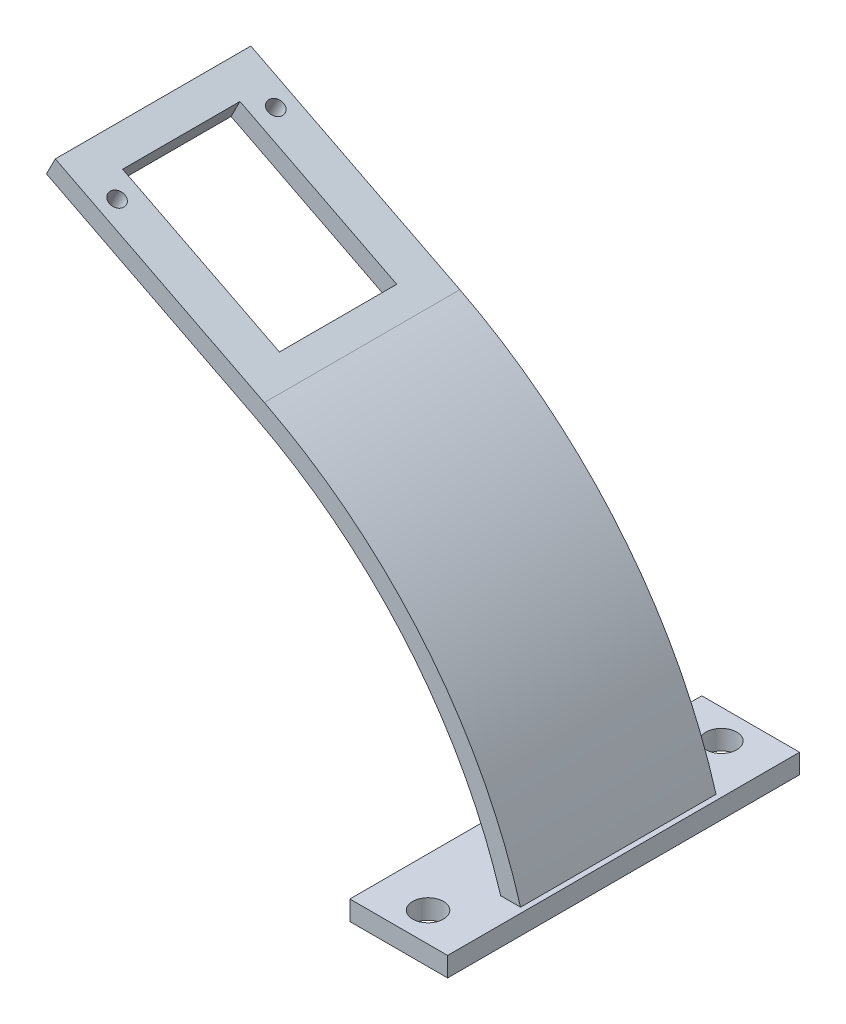
ISO-10303-21;
HEADER;
FILE_DESCRIPTION(('STEP AP214'),'2;1');
FILE_NAME('part.step','',(''),(''),'','','');
FILE_SCHEMA(('AUTOMOTIVE_DESIGN { 1 0 10303 214 1 1 1 1 }'));
ENDSEC;
DATA;
#1=APPLICATION_CONTEXT('core data for automotive mechanical design processes');
#2=APPLICATION_PROTOCOL_DEFINITION('international standard','automotive_design',2000,#1);
#3=PRODUCT_CONTEXT('',#1,'mechanical');
#4=PRODUCT('Part','Part','',(#3));
#5=PRODUCT_RELATED_PRODUCT_CATEGORY('part','',(#4));
#6=PRODUCT_DEFINITION_FORMATION('','',#4);
#7=PRODUCT_DEFINITION_CONTEXT('part definition',#1,'design');
#8=PRODUCT_DEFINITION('design','',#6,#7);
#9=PRODUCT_DEFINITION_SHAPE('','',#8);
#10=(LENGTH_UNIT() NAMED_UNIT(*) SI_UNIT(.MILLI.,.METRE.));
#11=(NAMED_UNIT(*) PLANE_ANGLE_UNIT() SI_UNIT($,.RADIAN.));
#12=(NAMED_UNIT(*) SI_UNIT($,.STERADIAN.) SOLID_ANGLE_UNIT());
#13=UNCERTAINTY_MEASURE_WITH_UNIT(LENGTH_MEASURE(1.E-05),#10,'distance_accuracy_value','');
#14=(GEOMETRIC_REPRESENTATION_CONTEXT(3) GLOBAL_UNCERTAINTY_ASSIGNED_CONTEXT((#13)) GLOBAL_UNIT_ASSIGNED_CONTEXT((#10,
#11,#12)) REPRESENTATION_CONTEXT('',''));
#15=CARTESIAN_POINT('',(0.,0.,0.));
#16=DIRECTION('',(0.,0.,1.));
#17=DIRECTION('',(1.,0.,0.));
#18=AXIS2_PLACEMENT_3D('',#15,#16,#17);
#19=CARTESIAN_POINT('',(-61.4066674593783,-16.1700708573998,25.4));
#20=DIRECTION('',(0.,0.,-1.));
#21=DIRECTION('',(-1.,0.,0.));
#22=AXIS2_PLACEMENT_3D('',#19,#20,#21);
#23=CYLINDRICAL_SURFACE('',#22,63.5);
#24=CARTESIAN_POINT('',(-61.4066674593783,-16.1700708573998,0.));
#25=DIRECTION('',(0.,0.,-1.));
#26=DIRECTION('',(1.,0.,0.));
#27=AXIS2_PLACEMENT_3D('',#24,#25,#26);
#28=CIRCLE('',#27,63.5);
#29=CARTESIAN_POINT('',(-32.578270725917,40.4088434285615,0.));
#30=VERTEX_POINT('',#29);
#31=CARTESIAN_POINT('',(-0.725671682190537,2.54,0.));
#32=VERTEX_POINT('',#31);
#33=EDGE_CURVE('E244',#30,#32,#28,.T.);
#34=ORIENTED_EDGE('',*,*,#33,.T.);
#35=DIRECTION('',(0.,0.,-1.));
#36=VECTOR('',#35,1.);
#37=CARTESIAN_POINT('',(-0.725671682190537,2.54,25.4));
#38=LINE('',#37,#36);
#39=CARTESIAN_POINT('',(-0.725671682190537,2.54,25.4));
#40=VERTEX_POINT('',#39);
#41=EDGE_CURVE('E60',#32,#40,#38,.F.);
#42=ORIENTED_EDGE('',*,*,#41,.T.);
#43=CARTESIAN_POINT('',(-61.4066674593783,-16.1700708573998,25.4));
#44=DIRECTION('',(0.,0.,-1.));
#45=DIRECTION('',(1.,0.,0.));
#46=AXIS2_PLACEMENT_3D('',#43,#44,#45);
#47=CIRCLE('',#46,63.5);
#48=CARTESIAN_POINT('',(-32.578270725917,40.4088434285615,25.4));
#49=VERTEX_POINT('',#48);
#50=EDGE_CURVE('E245',#49,#40,#47,.T.);
#51=ORIENTED_EDGE('',*,*,#50,.F.);
#52=DIRECTION('',(0.,0.,-1.));
#53=VECTOR('',#52,1.);
#54=CARTESIAN_POINT('',(-32.578270725917,40.4088434285615,25.4));
#55=LINE('',#54,#53);
#56=EDGE_CURVE('E262',#49,#30,#55,.T.);
#57=ORIENTED_EDGE('',*,*,#56,.T.);
#58=EDGE_LOOP('',(#34,#42,#51,#57));
#59=FACE_BOUND('',#58,.T.);
#60=ADVANCED_FACE('F45',(#59),#23,.F.);
#61=CARTESIAN_POINT('',(-61.2998634499794,-15.9604561865234,25.4));
#62=DIRECTION('',(0.,0.,-1.));
#63=DIRECTION('',(-1.,0.,0.));
#64=AXIS2_PLACEMENT_3D('',#61,#62,#63);
#65=CYLINDRICAL_SURFACE('',#64,65.8047439550823);
#66=CARTESIAN_POINT('',(-61.2998634499794,-15.9604561865234,25.4));
#67=DIRECTION('',(0.,0.,1.));
#68=DIRECTION('',(-1.,0.,0.));
#69=AXIS2_PLACEMENT_3D('',#66,#67,#68);
#70=CIRCLE('',#69,65.8047439550823);
#71=CARTESIAN_POINT('',(1.85072995882773,2.54,25.4));
#72=VERTEX_POINT('',#71);
#73=CARTESIAN_POINT('',(-31.4251348565786,42.672,25.4));
#74=VERTEX_POINT('',#73);
#75=EDGE_CURVE('E249',#72,#74,#70,.T.);
#76=ORIENTED_EDGE('',*,*,#75,.F.);
#77=DIRECTION('',(0.,0.,-1.));
#78=VECTOR('',#77,1.);
#79=CARTESIAN_POINT('',(1.85072995882773,2.54,25.4));
#80=LINE('',#79,#78);
#81=CARTESIAN_POINT('',(1.85072995882773,2.54,0.));
#82=VERTEX_POINT('',#81);
#83=EDGE_CURVE('E172',#72,#82,#80,.T.);
#84=ORIENTED_EDGE('',*,*,#83,.T.);
#85=CARTESIAN_POINT('',(-61.2998634499794,-15.9604561865234,0.));
#86=DIRECTION('',(0.,0.,1.));
#87=DIRECTION('',(-1.,0.,0.));
#88=AXIS2_PLACEMENT_3D('',#85,#86,#87);
#89=CIRCLE('',#88,65.8047439550823);
#90=CARTESIAN_POINT('',(-31.4251348565786,42.672,0.));
#91=VERTEX_POINT('',#90);
#92=EDGE_CURVE('E266',#82,#91,#89,.T.);
#93=ORIENTED_EDGE('',*,*,#92,.T.);
#94=DIRECTION('',(0.,0.,-1.));
#95=VECTOR('',#94,1.);
#96=CARTESIAN_POINT('',(-31.4251348565786,42.672,25.4));
#97=LINE('',#96,#95);
#98=EDGE_CURVE('E288',#74,#91,#97,.T.);
#99=ORIENTED_EDGE('',*,*,#98,.F.);
#100=EDGE_LOOP('',(#76,#84,#93,#99));
#101=FACE_BOUND('',#100,.T.);
#102=ADVANCED_FACE('F318',(#101),#65,.T.);
#103=CARTESIAN_POINT('',(-58.58301371384,56.5096304320614,25.4));
#104=DIRECTION('',(-0.453990499739548,-0.891006524188367,0.));
#105=DIRECTION('',(0.891006524188367,-0.453990499739548,0.));
#106=AXIS2_PLACEMENT_3D('',#103,#104,#105);
#107=PLANE('',#106);
#108=CARTESIAN_POINT('',(-52.9251222852439,53.6267907587153,23.03399));
#109=DIRECTION('',(0.453990499739548,0.891006524188367,0.));
#110=DIRECTION('',(-0.891006524188367,0.453990499739548,0.));
#111=AXIS2_PLACEMENT_3D('',#108,#109,#110);
#112=CIRCLE('',#111,0.999490000000002);
#113=CARTESIAN_POINT('',(-53.8156743961049,54.0805497233,23.03399));
#114=VERTEX_POINT('',#113);
#115=EDGE_CURVE('E193',#114,#114,#112,.T.);
#116=ORIENTED_EDGE('',*,*,#115,.F.);
#117=EDGE_LOOP('',(#116));
#118=FACE_BOUND('',#117,.T.);
#119=CARTESIAN_POINT('',(-52.9251222852439,53.6267907587153,2.41681));
#120=DIRECTION('',(0.453990499739548,0.891006524188367,0.));
#121=DIRECTION('',(-0.891006524188367,0.453990499739548,0.));
#122=AXIS2_PLACEMENT_3D('',#119,#120,#121);
#123=CIRCLE('',#122,0.999490000000002);
#124=CARTESIAN_POINT('',(-53.8156743961049,54.0805497233,2.41681));
#125=VERTEX_POINT('',#124);
#126=EDGE_CURVE('E192',#125,#125,#123,.T.);
#127=ORIENTED_EDGE('',*,*,#126,.F.);
#128=EDGE_LOOP('',(#127));
#129=FACE_BOUND('',#128,.T.);
#130=DIRECTION('',(0.891006524188367,-0.453990499739548,0.));
#131=VECTOR('',#130,1.);
#132=CARTESIAN_POINT('',(-54.9167000681097,54.6415503237331,20.32));
#133=LINE('',#132,#131);
#134=CARTESIAN_POINT('',(-54.9167000681097,54.6415503237331,20.32));
#135=VERTEX_POINT('',#134);
#136=CARTESIAN_POINT('',(-34.5482909251636,44.2633274996871,20.32));
#137=VERTEX_POINT('',#136);
#138=EDGE_CURVE('E216',#135,#137,#133,.T.);
#139=ORIENTED_EDGE('',*,*,#138,.F.);
#140=DIRECTION('',(0.,0.,1.));
#141=VECTOR('',#140,1.);
#142=CARTESIAN_POINT('',(-54.9167000681097,54.6415503237331,5.08));
#143=LINE('',#142,#141);
#144=CARTESIAN_POINT('',(-54.9167000681097,54.6415503237331,5.08));
#145=VERTEX_POINT('',#144);
#146=EDGE_CURVE('E67',#145,#135,#143,.T.);
#147=ORIENTED_EDGE('',*,*,#146,.F.);
#148=DIRECTION('',(-0.891006524188367,0.453990499739548,0.));
#149=VECTOR('',#148,1.);
#150=CARTESIAN_POINT('',(-54.9167000681097,54.6415503237331,5.08));
#151=LINE('',#150,#149);
#152=CARTESIAN_POINT('',(-34.5482909251636,44.2633274996871,5.08));
#153=VERTEX_POINT('',#152);
#154=EDGE_CURVE('E224',#153,#145,#151,.T.);
#155=ORIENTED_EDGE('',*,*,#154,.F.);
#156=DIRECTION('',(0.,0.,-1.));
#157=VECTOR('',#156,1.);
#158=CARTESIAN_POINT('',(-34.5482909251636,44.2633274996871,5.08));
#159=LINE('',#158,#157);
#160=EDGE_CURVE('E220',#137,#153,#159,.T.);
#161=ORIENTED_EDGE('',*,*,#160,.F.);
#162=EDGE_LOOP('',(#139,#147,#155,#161));
#163=FACE_BOUND('',#162,.T.);
#164=DIRECTION('',(-0.891006524188367,0.453990499739548,0.));
#165=VECTOR('',#164,1.);
#166=CARTESIAN_POINT('',(-58.58301371384,56.5096304320614,0.));
#167=LINE('',#166,#165);
#168=CARTESIAN_POINT('',(-58.58301371384,56.5096304320614,0.));
#169=VERTEX_POINT('',#168);
#170=EDGE_CURVE('E269',#91,#169,#167,.T.);
#171=ORIENTED_EDGE('',*,*,#170,.T.);
#172=DIRECTION('',(0.,0.,-1.));
#173=VECTOR('',#172,1.);
#174=CARTESIAN_POINT('',(-58.58301371384,56.5096304320614,25.4));
#175=LINE('',#174,#173);
#176=CARTESIAN_POINT('',(-58.58301371384,56.5096304320614,25.4));
#177=VERTEX_POINT('',#176);
#178=EDGE_CURVE('E284',#177,#169,#175,.T.);
#179=ORIENTED_EDGE('',*,*,#178,.F.);
#180=DIRECTION('',(-0.891006524188367,0.453990499739548,0.));
#181=VECTOR('',#180,1.);
#182=CARTESIAN_POINT('',(-58.58301371384,56.5096304320614,25.4));
#183=LINE('',#182,#181);
#184=EDGE_CURVE('E253',#74,#177,#183,.T.);
#185=ORIENTED_EDGE('',*,*,#184,.F.);
#186=ORIENTED_EDGE('',*,*,#98,.T.);
#187=EDGE_LOOP('',(#171,#179,#185,#186));
#188=FACE_BOUND('',#187,.T.);
#189=ADVANCED_FACE('F296',(#118,#129,#163,#188),#107,.F.);
#190=CARTESIAN_POINT('',(-59.7361495831784,54.246473860623,25.4));
#191=DIRECTION('',(0.891006524188368,-0.453990499739547,0.));
#192=DIRECTION('',(0.453990499739547,0.891006524188368,0.));
#193=AXIS2_PLACEMENT_3D('',#190,#191,#192);
#194=PLANE('',#193);
#195=DIRECTION('',(-0.453990499739547,-0.891006524188368,0.));
#196=VECTOR('',#195,1.);
#197=CARTESIAN_POINT('',(-59.7361495831784,54.246473860623,0.));
#198=LINE('',#197,#196);
#199=CARTESIAN_POINT('',(-59.7361495831784,54.246473860623,0.));
#200=VERTEX_POINT('',#199);
#201=EDGE_CURVE('E272',#169,#200,#198,.T.);
#202=ORIENTED_EDGE('',*,*,#201,.T.);
#203=DIRECTION('',(0.,0.,-1.));
#204=VECTOR('',#203,1.);
#205=CARTESIAN_POINT('',(-59.7361495831784,54.246473860623,25.4));
#206=LINE('',#205,#204);
#207=CARTESIAN_POINT('',(-59.7361495831784,54.246473860623,25.4));
#208=VERTEX_POINT('',#207);
#209=EDGE_CURVE('E280',#208,#200,#206,.T.);
#210=ORIENTED_EDGE('',*,*,#209,.F.);
#211=DIRECTION('',(-0.453990499739547,-0.891006524188368,0.));
#212=VECTOR('',#211,1.);
#213=CARTESIAN_POINT('',(-59.7361495831784,54.246473860623,25.4));
#214=LINE('',#213,#212);
#215=EDGE_CURVE('E256',#177,#208,#214,.T.);
#216=ORIENTED_EDGE('',*,*,#215,.F.);
#217=ORIENTED_EDGE('',*,*,#178,.T.);
#218=EDGE_LOOP('',(#202,#210,#216,#217));
#219=FACE_BOUND('',#218,.T.);
#220=ADVANCED_FACE('F308',(#219),#194,.F.);
#221=CARTESIAN_POINT('',(-32.578270725917,40.4088434285615,25.4));
#222=DIRECTION('',(0.453990499739548,0.891006524188367,0.));
#223=DIRECTION('',(-0.891006524188367,0.453990499739548,0.));
#224=AXIS2_PLACEMENT_3D('',#221,#222,#223);
#225=PLANE('',#224);
#226=CARTESIAN_POINT('',(-54.0782581545823,51.3636341872768,23.03399));
#227=DIRECTION('',(0.453990499739548,0.891006524188367,0.));
#228=DIRECTION('',(-0.891006524188367,0.453990499739548,0.));
#229=AXIS2_PLACEMENT_3D('',#226,#227,#228);
#230=CIRCLE('',#229,0.999490000000002);
#231=CARTESIAN_POINT('',(-54.9688102654434,51.8173931518615,23.03399));
#232=VERTEX_POINT('',#231);
#233=EDGE_CURVE('E187',#232,#232,#230,.F.);
#234=ORIENTED_EDGE('',*,*,#233,.F.);
#235=EDGE_LOOP('',(#234));
#236=FACE_BOUND('',#235,.T.);
#237=CARTESIAN_POINT('',(-54.0782581545823,51.3636341872768,2.41681));
#238=DIRECTION('',(0.453990499739548,0.891006524188367,0.));
#239=DIRECTION('',(-0.891006524188367,0.453990499739548,0.));
#240=AXIS2_PLACEMENT_3D('',#237,#238,#239);
#241=CIRCLE('',#240,0.999490000000002);
#242=CARTESIAN_POINT('',(-54.9688102654434,51.8173931518615,2.41681));
#243=VERTEX_POINT('',#242);
#244=EDGE_CURVE('E188',#243,#243,#241,.F.);
#245=ORIENTED_EDGE('',*,*,#244,.F.);
#246=EDGE_LOOP('',(#245));
#247=FACE_BOUND('',#246,.T.);
#248=DIRECTION('',(0.891006524188367,-0.453990499739548,0.));
#249=VECTOR('',#248,1.);
#250=CARTESIAN_POINT('',(-56.0698359374481,52.3783937522947,5.08));
#251=LINE('',#250,#249);
#252=CARTESIAN_POINT('',(-56.0698359374482,52.3783937522947,5.08));
#253=VERTEX_POINT('',#252);
#254=CARTESIAN_POINT('',(-35.7014267945021,42.0001709282486,5.08));
#255=VERTEX_POINT('',#254);
#256=EDGE_CURVE('E206',#253,#255,#251,.T.);
#257=ORIENTED_EDGE('',*,*,#256,.F.);
#258=DIRECTION('',(0.,0.,-1.));
#259=VECTOR('',#258,1.);
#260=CARTESIAN_POINT('',(-56.0698359374482,52.3783937522947,5.08));
#261=LINE('',#260,#259);
#262=CARTESIAN_POINT('',(-56.0698359374482,52.3783937522947,20.32));
#263=VERTEX_POINT('',#262);
#264=EDGE_CURVE('E210',#263,#253,#261,.T.);
#265=ORIENTED_EDGE('',*,*,#264,.F.);
#266=DIRECTION('',(-0.891006524188367,0.453990499739548,0.));
#267=VECTOR('',#266,1.);
#268=CARTESIAN_POINT('',(-56.0698359374481,52.3783937522947,20.32));
#269=LINE('',#268,#267);
#270=CARTESIAN_POINT('',(-35.7014267945021,42.0001709282486,20.32));
#271=VERTEX_POINT('',#270);
#272=EDGE_CURVE('E232',#271,#263,#269,.T.);
#273=ORIENTED_EDGE('',*,*,#272,.F.);
#274=DIRECTION('',(0.,0.,1.));
#275=VECTOR('',#274,1.);
#276=CARTESIAN_POINT('',(-35.7014267945021,42.0001709282486,5.08));
#277=LINE('',#276,#275);
#278=EDGE_CURVE('E197',#255,#271,#277,.T.);
#279=ORIENTED_EDGE('',*,*,#278,.F.);
#280=EDGE_LOOP('',(#257,#265,#273,#279));
#281=FACE_BOUND('',#280,.T.);
#282=DIRECTION('',(0.891006524188367,-0.453990499739548,0.));
#283=VECTOR('',#282,1.);
#284=CARTESIAN_POINT('',(-32.578270725917,40.4088434285615,0.));
#285=LINE('',#284,#283);
#286=EDGE_CURVE('E250',#200,#30,#285,.T.);
#287=ORIENTED_EDGE('',*,*,#286,.T.);
#288=ORIENTED_EDGE('',*,*,#56,.F.);
#289=DIRECTION('',(0.891006524188367,-0.453990499739548,0.));
#290=VECTOR('',#289,1.);
#291=CARTESIAN_POINT('',(-32.578270725917,40.4088434285615,25.4));
#292=LINE('',#291,#290);
#293=EDGE_CURVE('E259',#208,#49,#292,.T.);
#294=ORIENTED_EDGE('',*,*,#293,.F.);
#295=ORIENTED_EDGE('',*,*,#209,.T.);
#296=EDGE_LOOP('',(#287,#288,#294,#295));
#297=FACE_BOUND('',#296,.T.);
#298=ADVANCED_FACE('F312',(#236,#247,#281,#297),#225,.F.);
#299=CARTESIAN_POINT('',(-61.4066674593783,-16.1700708573998,25.4));
#300=DIRECTION('',(0.,0.,1.));
#301=DIRECTION('',(1.,0.,0.));
#302=AXIS2_PLACEMENT_3D('',#299,#300,#301);
#303=PLANE('',#302);
#304=DIRECTION('',(-1.,0.,0.));
#305=VECTOR('',#304,1.);
#306=CARTESIAN_POINT('',(-61.4066674593783,2.54,25.4));
#307=LINE('',#306,#305);
#308=EDGE_CURVE('E184',#72,#40,#307,.T.);
#309=ORIENTED_EDGE('',*,*,#308,.F.);
#310=ORIENTED_EDGE('',*,*,#75,.T.);
#311=ORIENTED_EDGE('',*,*,#184,.T.);
#312=ORIENTED_EDGE('',*,*,#215,.T.);
#313=ORIENTED_EDGE('',*,*,#293,.T.);
#314=ORIENTED_EDGE('',*,*,#50,.T.);
#315=EDGE_LOOP('',(#309,#310,#311,#312,#313,#314));
#316=FACE_BOUND('',#315,.T.);
#317=ADVANCED_FACE('F317',(#316),#303,.T.);
#318=CARTESIAN_POINT('',(-61.4066674593783,-16.1700708573998,0.));
#319=DIRECTION('',(0.,0.,1.));
#320=DIRECTION('',(1.,0.,0.));
#321=AXIS2_PLACEMENT_3D('',#318,#319,#320);
#322=PLANE('',#321);
#323=ORIENTED_EDGE('',*,*,#92,.F.);
#324=DIRECTION('',(-1.,0.,0.));
#325=VECTOR('',#324,1.);
#326=CARTESIAN_POINT('',(-61.4066674593783,2.54,0.));
#327=LINE('',#326,#325);
#328=EDGE_CURVE('E11',#82,#32,#327,.T.);
#329=ORIENTED_EDGE('',*,*,#328,.T.);
#330=ORIENTED_EDGE('',*,*,#33,.F.);
#331=ORIENTED_EDGE('',*,*,#286,.F.);
#332=ORIENTED_EDGE('',*,*,#201,.F.);
#333=ORIENTED_EDGE('',*,*,#170,.F.);
#334=EDGE_LOOP('',(#323,#329,#330,#331,#332,#333));
#335=FACE_BOUND('',#334,.T.);
#336=ADVANCED_FACE('F303',(#335),#322,.F.);
#337=CARTESIAN_POINT('',(-78.0136061723994,9.31131975878824,5.08));
#338=DIRECTION('',(-0.891006524188368,0.453990499739548,0.));
#339=DIRECTION('',(-0.453990499739548,-0.891006524188367,0.));
#340=AXIS2_PLACEMENT_3D('',#337,#338,#339);
#341=PLANE('',#340);
#342=ORIENTED_EDGE('',*,*,#264,.T.);
#343=DIRECTION('',(0.453990499739548,0.891006524188368,0.));
#344=VECTOR('',#343,1.);
#345=CARTESIAN_POINT('',(-78.0136061723994,9.31131975878824,5.08));
#346=LINE('',#345,#344);
#347=EDGE_CURVE('E229',#253,#145,#346,.T.);
#348=ORIENTED_EDGE('',*,*,#347,.T.);
#349=ORIENTED_EDGE('',*,*,#146,.T.);
#350=DIRECTION('',(0.453990499739548,0.891006524188368,0.));
#351=VECTOR('',#350,1.);
#352=CARTESIAN_POINT('',(-78.0136061723994,9.31131975878824,20.32));
#353=LINE('',#352,#351);
#354=EDGE_CURVE('E228',#263,#135,#353,.T.);
#355=ORIENTED_EDGE('',*,*,#354,.F.);
#356=EDGE_LOOP('',(#342,#348,#349,#355));
#357=FACE_BOUND('',#356,.T.);
#358=ADVANCED_FACE('F414',(#357),#341,.F.);
#359=CARTESIAN_POINT('',(-78.0136061723994,9.31131975878824,5.08));
#360=DIRECTION('',(0.,0.,-1.));
#361=DIRECTION('',(-1.,0.,0.));
#362=AXIS2_PLACEMENT_3D('',#359,#360,#361);
#363=PLANE('',#362);
#364=ORIENTED_EDGE('',*,*,#256,.T.);
#365=DIRECTION('',(0.453990499739548,0.891006524188368,0.));
#366=VECTOR('',#365,1.);
#367=CARTESIAN_POINT('',(-57.6451970294533,-1.06690306525782,5.08));
#368=LINE('',#367,#366);
#369=EDGE_CURVE('E233',#255,#153,#368,.T.);
#370=ORIENTED_EDGE('',*,*,#369,.T.);
#371=ORIENTED_EDGE('',*,*,#154,.T.);
#372=ORIENTED_EDGE('',*,*,#347,.F.);
#373=EDGE_LOOP('',(#364,#370,#371,#372));
#374=FACE_BOUND('',#373,.T.);
#375=ADVANCED_FACE('F410',(#374),#363,.F.);
#376=CARTESIAN_POINT('',(-57.6451970294533,-1.06690306525782,5.08));
#377=DIRECTION('',(0.891006524188368,-0.453990499739548,0.));
#378=DIRECTION('',(0.453990499739548,0.891006524188367,0.));
#379=AXIS2_PLACEMENT_3D('',#376,#377,#378);
#380=PLANE('',#379);
#381=ORIENTED_EDGE('',*,*,#278,.T.);
#382=DIRECTION('',(0.453990499739548,0.891006524188368,0.));
#383=VECTOR('',#382,1.);
#384=CARTESIAN_POINT('',(-57.6451970294533,-1.06690306525782,20.32));
#385=LINE('',#384,#383);
#386=EDGE_CURVE('E236',#271,#137,#385,.T.);
#387=ORIENTED_EDGE('',*,*,#386,.T.);
#388=ORIENTED_EDGE('',*,*,#160,.T.);
#389=ORIENTED_EDGE('',*,*,#369,.F.);
#390=EDGE_LOOP('',(#381,#387,#388,#389));
#391=FACE_BOUND('',#390,.T.);
#392=ADVANCED_FACE('F413',(#391),#380,.F.);
#393=CARTESIAN_POINT('',(-78.0136061723994,9.31131975878824,20.32));
#394=DIRECTION('',(0.,0.,1.));
#395=DIRECTION('',(1.,0.,0.));
#396=AXIS2_PLACEMENT_3D('',#393,#394,#395);
#397=PLANE('',#396);
#398=ORIENTED_EDGE('',*,*,#272,.T.);
#399=ORIENTED_EDGE('',*,*,#354,.T.);
#400=ORIENTED_EDGE('',*,*,#138,.T.);
#401=ORIENTED_EDGE('',*,*,#386,.F.);
#402=EDGE_LOOP('',(#398,#399,#400,#401));
#403=FACE_BOUND('',#402,.T.);
#404=ADVANCED_FACE('F406',(#403),#397,.F.);
#405=CARTESIAN_POINT('',(-76.0220283895336,8.29656019377041,2.41681));
#406=DIRECTION('',(0.453990499739548,0.891006524188368,0.));
#407=DIRECTION('',(-0.891006524188367,0.453990499739548,0.));
#408=AXIS2_PLACEMENT_3D('',#405,#406,#407);
#409=CYLINDRICAL_SURFACE('',#408,0.999490000000002);
#410=ORIENTED_EDGE('',*,*,#126,.T.);
#411=EDGE_LOOP('',(#410));
#412=FACE_BOUND('',#411,.T.);
#413=ORIENTED_EDGE('',*,*,#244,.T.);
#414=EDGE_LOOP('',(#413));
#415=FACE_BOUND('',#414,.T.);
#416=ADVANCED_FACE('F402',(#412,#415),#409,.F.);
#417=CARTESIAN_POINT('',(-76.0220283895336,8.29656019377041,23.03399));
#418=DIRECTION('',(0.453990499739548,0.891006524188368,0.));
#419=DIRECTION('',(-0.891006524188367,0.453990499739548,0.));
#420=AXIS2_PLACEMENT_3D('',#417,#418,#419);
#421=CYLINDRICAL_SURFACE('',#420,0.999490000000002);
#422=ORIENTED_EDGE('',*,*,#115,.T.);
#423=EDGE_LOOP('',(#422));
#424=FACE_BOUND('',#423,.T.);
#425=ORIENTED_EDGE('',*,*,#233,.T.);
#426=EDGE_LOOP('',(#425));
#427=FACE_BOUND('',#426,.T.);
#428=ADVANCED_FACE('F405',(#424,#427),#421,.F.);
#429=CARTESIAN_POINT('',(0.,2.54,0.));
#430=DIRECTION('',(0.,1.,0.));
#431=DIRECTION('',(0.,0.,1.));
#432=AXIS2_PLACEMENT_3D('',#429,#430,#431);
#433=PLANE('',#432);
#434=ORIENTED_EDGE('',*,*,#83,.F.);
#435=ORIENTED_EDGE('',*,*,#308,.T.);
#436=ORIENTED_EDGE('',*,*,#41,.F.);
#437=ORIENTED_EDGE('',*,*,#328,.F.);
#438=EDGE_LOOP('',(#434,#435,#436,#437));
#439=FACE_BOUND('',#438,.T.);
#440=CARTESIAN_POINT('',(-3.81,2.54,-6.35));
#441=DIRECTION('',(0.,1.,0.));
#442=DIRECTION('',(0.,0.,1.));
#443=AXIS2_PLACEMENT_3D('',#440,#441,#442);
#444=CIRCLE('',#443,2.);
#445=CARTESIAN_POINT('',(-3.81,2.54,-4.35));
#446=VERTEX_POINT('',#445);
#447=EDGE_CURVE('E362',#446,#446,#444,.T.);
#448=ORIENTED_EDGE('',*,*,#447,.F.);
#449=EDGE_LOOP('',(#448));
#450=FACE_BOUND('',#449,.T.);
#451=DIRECTION('',(0.,0.,-1.));
#452=VECTOR('',#451,1.);
#453=CARTESIAN_POINT('',(2.54,2.54,35.56));
#454=LINE('',#453,#452);
#455=CARTESIAN_POINT('',(2.54,2.54,35.56));
#456=VERTEX_POINT('',#455);
#457=CARTESIAN_POINT('',(2.54,2.54,-10.16));
#458=VERTEX_POINT('',#457);
#459=EDGE_CURVE('E156',#456,#458,#454,.T.);
#460=ORIENTED_EDGE('',*,*,#459,.T.);
#461=DIRECTION('',(-1.,0.,0.));
#462=VECTOR('',#461,1.);
#463=CARTESIAN_POINT('',(2.54,2.54,-10.16));
#464=LINE('',#463,#462);
#465=CARTESIAN_POINT('',(-10.16,2.54,-10.16));
#466=VERTEX_POINT('',#465);
#467=EDGE_CURVE('E145',#458,#466,#464,.T.);
#468=ORIENTED_EDGE('',*,*,#467,.T.);
#469=DIRECTION('',(0.,0.,1.));
#470=VECTOR('',#469,1.);
#471=CARTESIAN_POINT('',(-10.16,2.54,35.56));
#472=LINE('',#471,#470);
#473=CARTESIAN_POINT('',(-10.16,2.54,35.56));
#474=VERTEX_POINT('',#473);
#475=EDGE_CURVE('E155',#466,#474,#472,.T.);
#476=ORIENTED_EDGE('',*,*,#475,.T.);
#477=DIRECTION('',(1.,0.,0.));
#478=VECTOR('',#477,1.);
#479=CARTESIAN_POINT('',(2.54,2.54,35.56));
#480=LINE('',#479,#478);
#481=EDGE_CURVE('E162',#474,#456,#480,.T.);
#482=ORIENTED_EDGE('',*,*,#481,.T.);
#483=EDGE_LOOP('',(#460,#468,#476,#482));
#484=FACE_BOUND('',#483,.T.);
#485=CARTESIAN_POINT('',(-3.81,2.54,31.75));
#486=DIRECTION('',(0.,1.,0.));
#487=DIRECTION('',(0.,0.,1.));
#488=AXIS2_PLACEMENT_3D('',#485,#486,#487);
#489=CIRCLE('',#488,2.);
#490=CARTESIAN_POINT('',(-3.81,2.54,33.75));
#491=VERTEX_POINT('',#490);
#492=EDGE_CURVE('E356',#491,#491,#489,.T.);
#493=ORIENTED_EDGE('',*,*,#492,.F.);
#494=EDGE_LOOP('',(#493));
#495=FACE_BOUND('',#494,.T.);
#496=ADVANCED_FACE('F159',(#439,#450,#484,#495),#433,.T.);
#497=CARTESIAN_POINT('',(2.54,2.54,35.56));
#498=DIRECTION('',(-1.,0.,0.));
#499=DIRECTION('',(0.,0.,1.));
#500=AXIS2_PLACEMENT_3D('',#497,#498,#499);
#501=PLANE('',#500);
#502=DIRECTION('',(0.,-1.,0.));
#503=VECTOR('',#502,1.);
#504=CARTESIAN_POINT('',(2.54,2.54,35.56));
#505=LINE('',#504,#503);
#506=CARTESIAN_POINT('',(2.54,0.,35.56));
#507=VERTEX_POINT('',#506);
#508=EDGE_CURVE('E373',#456,#507,#505,.T.);
#509=ORIENTED_EDGE('',*,*,#508,.T.);
#510=DIRECTION('',(0.,0.,-1.));
#511=VECTOR('',#510,1.);
#512=CARTESIAN_POINT('',(2.54,0.,25.4));
#513=LINE('',#512,#511);
#514=CARTESIAN_POINT('',(2.54,0.,-10.16));
#515=VERTEX_POINT('',#514);
#516=EDGE_CURVE('E53',#507,#515,#513,.T.);
#517=ORIENTED_EDGE('',*,*,#516,.T.);
#518=DIRECTION('',(0.,-1.,0.));
#519=VECTOR('',#518,1.);
#520=CARTESIAN_POINT('',(2.54,2.54,-10.16));
#521=LINE('',#520,#519);
#522=EDGE_CURVE('E149',#458,#515,#521,.T.);
#523=ORIENTED_EDGE('',*,*,#522,.F.);
#524=ORIENTED_EDGE('',*,*,#459,.F.);
#525=EDGE_LOOP('',(#509,#517,#523,#524));
#526=FACE_BOUND('',#525,.T.);
#527=ADVANCED_FACE('F169',(#526),#501,.F.);
#528=CARTESIAN_POINT('',(2.54,2.54,-10.16));
#529=DIRECTION('',(0.,0.,1.));
#530=DIRECTION('',(1.,0.,0.));
#531=AXIS2_PLACEMENT_3D('',#528,#529,#530);
#532=PLANE('',#531);
#533=DIRECTION('',(-1.,0.,0.));
#534=VECTOR('',#533,1.);
#535=CARTESIAN_POINT('',(2.54,0.,-10.16));
#536=LINE('',#535,#534);
#537=CARTESIAN_POINT('',(-10.16,0.,-10.16));
#538=VERTEX_POINT('',#537);
#539=EDGE_CURVE('E366',#515,#538,#536,.T.);
#540=ORIENTED_EDGE('',*,*,#539,.T.);
#541=DIRECTION('',(0.,-1.,0.));
#542=VECTOR('',#541,1.);
#543=CARTESIAN_POINT('',(-10.16,2.54,-10.16));
#544=LINE('',#543,#542);
#545=EDGE_CURVE('E151',#466,#538,#544,.T.);
#546=ORIENTED_EDGE('',*,*,#545,.F.);
#547=ORIENTED_EDGE('',*,*,#467,.F.);
#548=ORIENTED_EDGE('',*,*,#522,.T.);
#549=EDGE_LOOP('',(#540,#546,#547,#548));
#550=FACE_BOUND('',#549,.T.);
#551=ADVANCED_FACE('F147',(#550),#532,.F.);
#552=CARTESIAN_POINT('',(-10.16,2.54,35.56));
#553=DIRECTION('',(1.,0.,0.));
#554=DIRECTION('',(0.,0.,-1.));
#555=AXIS2_PLACEMENT_3D('',#552,#553,#554);
#556=PLANE('',#555);
#557=DIRECTION('',(0.,0.,1.));
#558=VECTOR('',#557,1.);
#559=CARTESIAN_POINT('',(-10.16,0.,35.56));
#560=LINE('',#559,#558);
#561=CARTESIAN_POINT('',(-10.16,0.,35.56));
#562=VERTEX_POINT('',#561);
#563=EDGE_CURVE('E376',#538,#562,#560,.T.);
#564=ORIENTED_EDGE('',*,*,#563,.T.);
#565=DIRECTION('',(0.,-1.,0.));
#566=VECTOR('',#565,1.);
#567=CARTESIAN_POINT('',(-10.16,2.54,35.56));
#568=LINE('',#567,#566);
#569=EDGE_CURVE('E178',#474,#562,#568,.T.);
#570=ORIENTED_EDGE('',*,*,#569,.F.);
#571=ORIENTED_EDGE('',*,*,#475,.F.);
#572=ORIENTED_EDGE('',*,*,#545,.T.);
#573=EDGE_LOOP('',(#564,#570,#571,#572));
#574=FACE_BOUND('',#573,.T.);
#575=ADVANCED_FACE('F389',(#574),#556,.F.);
#576=CARTESIAN_POINT('',(2.54,2.54,35.56));
#577=DIRECTION('',(0.,0.,-1.));
#578=DIRECTION('',(-1.,0.,0.));
#579=AXIS2_PLACEMENT_3D('',#576,#577,#578);
#580=PLANE('',#579);
#581=DIRECTION('',(1.,0.,0.));
#582=VECTOR('',#581,1.);
#583=CARTESIAN_POINT('',(2.54,0.,35.56));
#584=LINE('',#583,#582);
#585=EDGE_CURVE('E167',#562,#507,#584,.T.);
#586=ORIENTED_EDGE('',*,*,#585,.T.);
#587=ORIENTED_EDGE('',*,*,#508,.F.);
#588=ORIENTED_EDGE('',*,*,#481,.F.);
#589=ORIENTED_EDGE('',*,*,#569,.T.);
#590=EDGE_LOOP('',(#586,#587,#588,#589));
#591=FACE_BOUND('',#590,.T.);
#592=ADVANCED_FACE('F386',(#591),#580,.F.);
#593=CARTESIAN_POINT('',(-3.81,2.54,-6.35));
#594=DIRECTION('',(0.,-1.,0.));
#595=DIRECTION('',(0.,0.,-1.));
#596=AXIS2_PLACEMENT_3D('',#593,#594,#595);
#597=CYLINDRICAL_SURFACE('',#596,2.);
#598=ORIENTED_EDGE('',*,*,#447,.T.);
#599=EDGE_LOOP('',(#598));
#600=FACE_BOUND('',#599,.T.);
#601=CARTESIAN_POINT('',(-3.81,0.,-6.35));
#602=DIRECTION('',(0.,1.,0.));
#603=DIRECTION('',(0.,0.,1.));
#604=AXIS2_PLACEMENT_3D('',#601,#602,#603);
#605=CIRCLE('',#604,2.);
#606=CARTESIAN_POINT('',(-3.81,0.,-4.35));
#607=VERTEX_POINT('',#606);
#608=EDGE_CURVE('E350',#607,#607,#605,.T.);
#609=ORIENTED_EDGE('',*,*,#608,.F.);
#610=EDGE_LOOP('',(#609));
#611=FACE_BOUND('',#610,.T.);
#612=ADVANCED_FACE('F341',(#600,#611),#597,.F.);
#613=CARTESIAN_POINT('',(-3.81,2.54,31.75));
#614=DIRECTION('',(0.,-1.,0.));
#615=DIRECTION('',(0.,0.,-1.));
#616=AXIS2_PLACEMENT_3D('',#613,#614,#615);
#617=CYLINDRICAL_SURFACE('',#616,2.);
#618=ORIENTED_EDGE('',*,*,#492,.T.);
#619=EDGE_LOOP('',(#618));
#620=FACE_BOUND('',#619,.T.);
#621=CARTESIAN_POINT('',(-3.81,0.,31.75));
#622=DIRECTION('',(0.,1.,0.));
#623=DIRECTION('',(0.,0.,1.));
#624=AXIS2_PLACEMENT_3D('',#621,#622,#623);
#625=CIRCLE('',#624,2.);
#626=CARTESIAN_POINT('',(-3.81,0.,33.75));
#627=VERTEX_POINT('',#626);
#628=EDGE_CURVE('E353',#627,#627,#625,.T.);
#629=ORIENTED_EDGE('',*,*,#628,.F.);
#630=EDGE_LOOP('',(#629));
#631=FACE_BOUND('',#630,.T.);
#632=ADVANCED_FACE('F336',(#620,#631),#617,.F.);
#633=CARTESIAN_POINT('',(0.,0.,25.4));
#634=DIRECTION('',(0.,1.,0.));
#635=DIRECTION('',(0.,0.,1.));
#636=AXIS2_PLACEMENT_3D('',#633,#634,#635);
#637=PLANE('',#636);
#638=ORIENTED_EDGE('',*,*,#516,.F.);
#639=ORIENTED_EDGE('',*,*,#585,.F.);
#640=ORIENTED_EDGE('',*,*,#563,.F.);
#641=ORIENTED_EDGE('',*,*,#539,.F.);
#642=EDGE_LOOP('',(#638,#639,#640,#641));
#643=FACE_BOUND('',#642,.T.);
#644=ORIENTED_EDGE('',*,*,#608,.T.);
#645=EDGE_LOOP('',(#644));
#646=FACE_BOUND('',#645,.T.);
#647=ORIENTED_EDGE('',*,*,#628,.T.);
#648=EDGE_LOOP('',(#647));
#649=FACE_BOUND('',#648,.T.);
#650=ADVANCED_FACE('F334',(#643,#646,#649),#637,.F.);
#651=CLOSED_SHELL('',(#60,#102,#189,#220,#298,#317,#336,#358,#375,#392,#404,#416,#428,#496,#527,
#551,#575,#592,#612,#632,#650));
#652=MANIFOLD_SOLID_BREP('B2',#651);
#653=ADVANCED_BREP_SHAPE_REPRESENTATION('',(#18,#652),#14);
#654=SHAPE_DEFINITION_REPRESENTATION(#9,#653);
ENDSEC;
END-ISO-10303-21;
